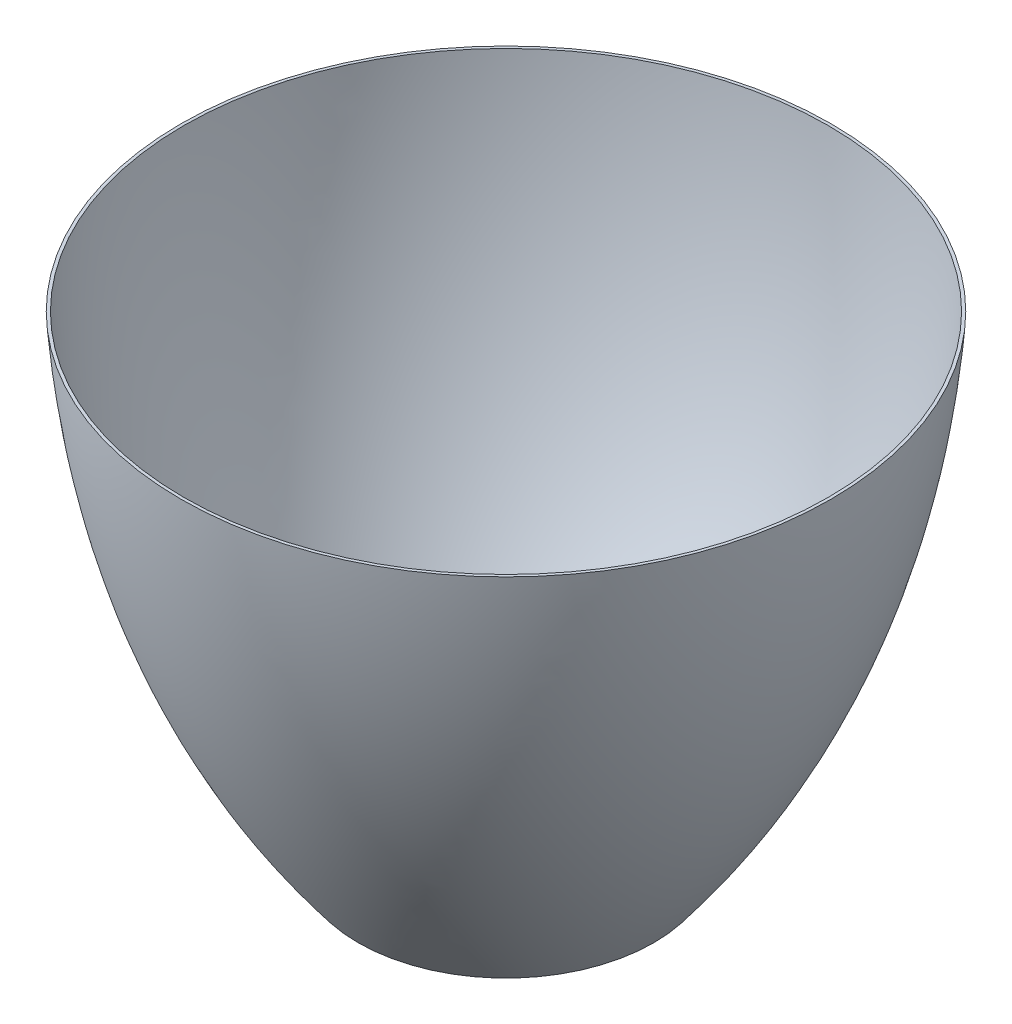
ISO-10303-21;
HEADER;
FILE_DESCRIPTION(('STEP AP214'),'2;1');
FILE_NAME('part.step','',(''),(''),'','','');
FILE_SCHEMA(('AUTOMOTIVE_DESIGN { 1 0 10303 214 1 1 1 1 }'));
ENDSEC;
DATA;
#1=APPLICATION_CONTEXT('core data for automotive mechanical design processes');
#2=APPLICATION_PROTOCOL_DEFINITION('international standard','automotive_design',2000,#1);
#3=PRODUCT_CONTEXT('',#1,'mechanical');
#4=PRODUCT('Part','Part','',(#3));
#5=PRODUCT_RELATED_PRODUCT_CATEGORY('part','',(#4));
#6=PRODUCT_DEFINITION_FORMATION('','',#4);
#7=PRODUCT_DEFINITION_CONTEXT('part definition',#1,'design');
#8=PRODUCT_DEFINITION('design','',#6,#7);
#9=PRODUCT_DEFINITION_SHAPE('','',#8);
#10=(LENGTH_UNIT() NAMED_UNIT(*) SI_UNIT(.MILLI.,.METRE.));
#11=(NAMED_UNIT(*) PLANE_ANGLE_UNIT() SI_UNIT($,.RADIAN.));
#12=(NAMED_UNIT(*) SI_UNIT($,.STERADIAN.) SOLID_ANGLE_UNIT());
#13=UNCERTAINTY_MEASURE_WITH_UNIT(LENGTH_MEASURE(1.E-05),#10,'distance_accuracy_value','');
#14=(GEOMETRIC_REPRESENTATION_CONTEXT(3) GLOBAL_UNCERTAINTY_ASSIGNED_CONTEXT((#13)) GLOBAL_UNIT_ASSIGNED_CONTEXT((#10,
#11,#12)) REPRESENTATION_CONTEXT('',''));
#15=CARTESIAN_POINT('',(0.,0.,0.));
#16=DIRECTION('',(0.,0.,1.));
#17=DIRECTION('',(1.,0.,0.));
#18=AXIS2_PLACEMENT_3D('',#15,#16,#17);
#19=CARTESIAN_POINT('',(0.,80.,0.));
#20=DIRECTION('',(0.,-1.,0.));
#21=DIRECTION('',(1.,0.,0.));
#22=AXIS2_PLACEMENT_3D('',#19,#20,#21);
#23=PLANE('',#22);
#24=CARTESIAN_POINT('',(0.,80.,0.));
#25=DIRECTION('',(0.,1.,0.));
#26=DIRECTION('',(-1.,0.,0.));
#27=AXIS2_PLACEMENT_3D('',#24,#25,#26);
#28=CIRCLE('',#27,54.4984471367828);
#29=CARTESIAN_POINT('',(-54.4984471367828,80.,0.));
#30=VERTEX_POINT('',#29);
#31=EDGE_CURVE('E47',#30,#30,#28,.T.);
#32=ORIENTED_EDGE('',*,*,#31,.F.);
#33=EDGE_LOOP('',(#32));
#34=FACE_BOUND('',#33,.T.);
#35=CARTESIAN_POINT('',(0.,80.,0.));
#36=DIRECTION('',(0.,1.,0.));
#37=DIRECTION('',(-1.,0.,0.));
#38=AXIS2_PLACEMENT_3D('',#35,#36,#37);
#39=CIRCLE('',#38,55.);
#40=CARTESIAN_POINT('',(-55.,80.,0.));
#41=VERTEX_POINT('',#40);
#42=EDGE_CURVE('E10',#41,#41,#39,.T.);
#43=ORIENTED_EDGE('',*,*,#42,.T.);
#44=EDGE_LOOP('',(#43));
#45=FACE_BOUND('',#44,.T.);
#46=ADVANCED_FACE('F37',(#34,#45),#23,.F.);
#47=CARTESIAN_POINT('',(24.4718204747725,-0.688130561662374,0.));
#48=CARTESIAN_POINT('',(24.7359102373863,-0.344065280831187,0.));
#49=CARTESIAN_POINT('',(25.,0.,0.));
#50=CARTESIAN_POINT('',(51.4089762613738,34.4065280831187,0.));
#51=CARTESIAN_POINT('',(55.,80.,0.));
#52=B_SPLINE_CURVE_WITH_KNOTS('',2,(#47,#48,#49,#50,#51),.UNSPECIFIED.,.F.,.F.,(3,2,3),(-0.01,
0.,1.),.UNSPECIFIED.);
#53=CARTESIAN_POINT('',(0.,80.,0.));
#54=DIRECTION('',(0.,1.,0.));
#55=AXIS1_PLACEMENT('',#53,#54);
#56=SURFACE_OF_REVOLUTION('',#52,#55);
#57=ORIENTED_EDGE('',*,*,#42,.F.);
#58=EDGE_LOOP('',(#57));
#59=FACE_BOUND('',#58,.T.);
#60=CARTESIAN_POINT('',(0.,0.,0.));
#61=DIRECTION('',(0.,1.,0.));
#62=DIRECTION('',(-1.,0.,0.));
#63=AXIS2_PLACEMENT_3D('',#60,#61,#62);
#64=CIRCLE('',#63,25.);
#65=CARTESIAN_POINT('',(-25.,0.,0.));
#66=VERTEX_POINT('',#65);
#67=EDGE_CURVE('E43',#66,#66,#64,.T.);
#68=ORIENTED_EDGE('',*,*,#67,.T.);
#69=EDGE_LOOP('',(#68));
#70=FACE_BOUND('',#69,.T.);
#71=ADVANCED_FACE('F62',(#59,#70),#56,.T.);
#72=CARTESIAN_POINT('',(0.,0.,0.));
#73=DIRECTION('',(0.,1.,0.));
#74=DIRECTION('',(-1.,0.,0.));
#75=AXIS2_PLACEMENT_3D('',#72,#73,#74);
#76=PLANE('',#75);
#77=CARTESIAN_POINT('',(0.,0.,0.));
#78=DIRECTION('',(0.,1.,0.));
#79=DIRECTION('',(-1.,0.,0.));
#80=AXIS2_PLACEMENT_3D('',#77,#78,#79);
#81=CIRCLE('',#80,24.3696937328246);
#82=CARTESIAN_POINT('',(-24.3696937328246,0.,0.));
#83=VERTEX_POINT('',#82);
#84=EDGE_CURVE('E51',#83,#83,#81,.T.);
#85=ORIENTED_EDGE('',*,*,#84,.T.);
#86=EDGE_LOOP('',(#85));
#87=FACE_BOUND('',#86,.T.);
#88=ORIENTED_EDGE('',*,*,#67,.F.);
#89=EDGE_LOOP('',(#88));
#90=FACE_BOUND('',#89,.T.);
#91=ADVANCED_FACE('F66',(#87,#90),#76,.F.);
#92=CARTESIAN_POINT('',(24.4718204747725,-0.688130561662374,0.));
#93=CARTESIAN_POINT('',(24.7359102373863,-0.344065280831187,0.));
#94=CARTESIAN_POINT('',(51.4089762613738,34.4065280831187,0.));
#95=CARTESIAN_POINT('',(55.,80.,0.));
#96=B_SPLINE_CURVE_WITH_KNOTS('',2,(#92,#93,#94,#95),.UNSPECIFIED.,.F.,.F.,(3,1,3),(-0.01,0.,
1.),.UNSPECIFIED.);
#97=CARTESIAN_POINT('',(0.,80.,0.));
#98=DIRECTION('',(0.,1.,0.));
#99=AXIS1_PLACEMENT('',#97,#98);
#100=SURFACE_OF_REVOLUTION('',#96,#99);
#101=OFFSET_SURFACE('',#100,-0.5,.F.);
#102=ORIENTED_EDGE('',*,*,#31,.T.);
#103=EDGE_LOOP('',(#102));
#104=FACE_BOUND('',#103,.T.);
#105=ORIENTED_EDGE('',*,*,#84,.F.);
#106=EDGE_LOOP('',(#105));
#107=FACE_BOUND('',#106,.T.);
#108=ADVANCED_FACE('F68',(#104,#107),#101,.F.);
#109=CLOSED_SHELL('',(#46,#71,#91,#108));
#110=MANIFOLD_SOLID_BREP('B2',#109);
#111=ADVANCED_BREP_SHAPE_REPRESENTATION('',(#18,#110),#14);
#112=SHAPE_DEFINITION_REPRESENTATION(#9,#111);
ENDSEC;
END-ISO-10303-21;
